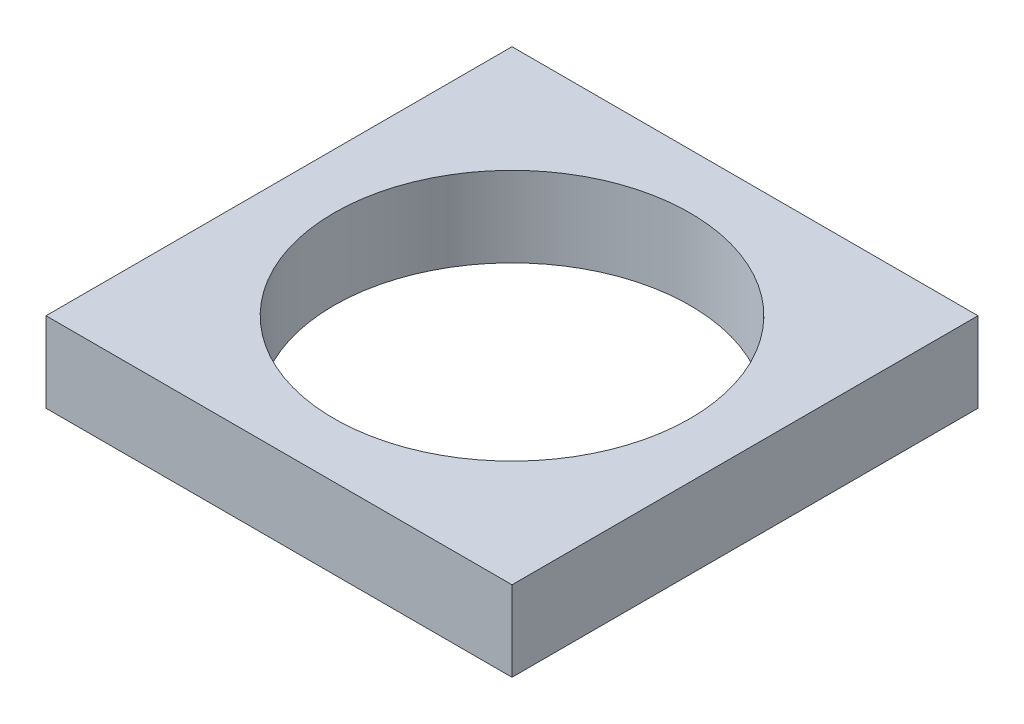
ISO-10303-21;
HEADER;
FILE_DESCRIPTION(('STEP AP214'),'2;1');
FILE_NAME('part.step','',(''),(''),'','','');
FILE_SCHEMA(('AUTOMOTIVE_DESIGN { 1 0 10303 214 1 1 1 1 }'));
ENDSEC;
DATA;
#1=APPLICATION_CONTEXT('core data for automotive mechanical design processes');
#2=APPLICATION_PROTOCOL_DEFINITION('international standard','automotive_design',2000,#1);
#3=PRODUCT_CONTEXT('',#1,'mechanical');
#4=PRODUCT('Part','Part','',(#3));
#5=PRODUCT_RELATED_PRODUCT_CATEGORY('part','',(#4));
#6=PRODUCT_DEFINITION_FORMATION('','',#4);
#7=PRODUCT_DEFINITION_CONTEXT('part definition',#1,'design');
#8=PRODUCT_DEFINITION('design','',#6,#7);
#9=PRODUCT_DEFINITION_SHAPE('','',#8);
#10=(LENGTH_UNIT() NAMED_UNIT(*) SI_UNIT(.MILLI.,.METRE.));
#11=(NAMED_UNIT(*) PLANE_ANGLE_UNIT() SI_UNIT($,.RADIAN.));
#12=(NAMED_UNIT(*) SI_UNIT($,.STERADIAN.) SOLID_ANGLE_UNIT());
#13=UNCERTAINTY_MEASURE_WITH_UNIT(LENGTH_MEASURE(1.E-05),#10,'distance_accuracy_value','');
#14=(GEOMETRIC_REPRESENTATION_CONTEXT(3) GLOBAL_UNCERTAINTY_ASSIGNED_CONTEXT((#13)) GLOBAL_UNIT_ASSIGNED_CONTEXT((#10,
#11,#12)) REPRESENTATION_CONTEXT('',''));
#15=CARTESIAN_POINT('',(0.,0.,0.));
#16=DIRECTION('',(0.,0.,1.));
#17=DIRECTION('',(1.,0.,0.));
#18=AXIS2_PLACEMENT_3D('',#15,#16,#17);
#19=CARTESIAN_POINT('',(0.,-1.35,0.));
#20=DIRECTION('',(0.,1.,0.));
#21=DIRECTION('',(1.,0.,0.));
#22=AXIS2_PLACEMENT_3D('',#19,#20,#21);
#23=PLANE('',#22);
#24=DIRECTION('',(-1.,0.,0.));
#25=VECTOR('',#24,1.);
#26=CARTESIAN_POINT('',(7.85,-1.35,-7.85));
#27=LINE('',#26,#25);
#28=CARTESIAN_POINT('',(7.85,-1.35,-7.85));
#29=VERTEX_POINT('',#28);
#30=CARTESIAN_POINT('',(-7.85,-1.35,-7.85));
#31=VERTEX_POINT('',#30);
#32=EDGE_CURVE('E80',#29,#31,#27,.T.);
#33=ORIENTED_EDGE('',*,*,#32,.F.);
#34=DIRECTION('',(0.,0.,-1.));
#35=VECTOR('',#34,1.);
#36=CARTESIAN_POINT('',(7.85,-1.35,7.85));
#37=LINE('',#36,#35);
#38=CARTESIAN_POINT('',(7.85,-1.35,7.85));
#39=VERTEX_POINT('',#38);
#40=EDGE_CURVE('E36',#39,#29,#37,.T.);
#41=ORIENTED_EDGE('',*,*,#40,.F.);
#42=DIRECTION('',(1.,0.,0.));
#43=VECTOR('',#42,1.);
#44=CARTESIAN_POINT('',(-7.85,-1.35,7.85));
#45=LINE('',#44,#43);
#46=CARTESIAN_POINT('',(-7.85,-1.35,7.85));
#47=VERTEX_POINT('',#46);
#48=EDGE_CURVE('E90',#47,#39,#45,.T.);
#49=ORIENTED_EDGE('',*,*,#48,.F.);
#50=DIRECTION('',(0.,0.,1.));
#51=VECTOR('',#50,1.);
#52=CARTESIAN_POINT('',(-7.85,-1.35,-7.85));
#53=LINE('',#52,#51);
#54=EDGE_CURVE('E82',#31,#47,#53,.T.);
#55=ORIENTED_EDGE('',*,*,#54,.F.);
#56=EDGE_LOOP('',(#33,#41,#49,#55));
#57=FACE_BOUND('',#56,.T.);
#58=CARTESIAN_POINT('',(0.,-1.35,0.));
#59=DIRECTION('',(0.,-1.,0.));
#60=DIRECTION('',(-1.,0.,0.));
#61=AXIS2_PLACEMENT_3D('',#58,#59,#60);
#62=CIRCLE('',#61,6.);
#63=CARTESIAN_POINT('',(-6.,-1.35,0.));
#64=VERTEX_POINT('',#63);
#65=EDGE_CURVE('E11',#64,#64,#62,.T.);
#66=ORIENTED_EDGE('',*,*,#65,.F.);
#67=EDGE_LOOP('',(#66));
#68=FACE_BOUND('',#67,.T.);
#69=ADVANCED_FACE('F17',(#57,#68),#23,.F.);
#70=CARTESIAN_POINT('',(0.,-1.35,0.));
#71=DIRECTION('',(0.,1.,0.));
#72=DIRECTION('',(1.,0.,0.));
#73=AXIS2_PLACEMENT_3D('',#70,#71,#72);
#74=CYLINDRICAL_SURFACE('',#73,6.);
#75=CARTESIAN_POINT('',(0.,1.35,0.));
#76=DIRECTION('',(0.,-1.,0.));
#77=DIRECTION('',(1.,0.,0.));
#78=AXIS2_PLACEMENT_3D('',#75,#76,#77);
#79=CIRCLE('',#78,6.);
#80=CARTESIAN_POINT('',(6.,1.35,0.));
#81=VERTEX_POINT('',#80);
#82=EDGE_CURVE('E73',#81,#81,#79,.T.);
#83=ORIENTED_EDGE('',*,*,#82,.F.);
#84=EDGE_LOOP('',(#83));
#85=FACE_BOUND('',#84,.T.);
#86=ORIENTED_EDGE('',*,*,#65,.T.);
#87=EDGE_LOOP('',(#86));
#88=FACE_BOUND('',#87,.T.);
#89=ADVANCED_FACE('F106',(#85,#88),#74,.F.);
#90=CARTESIAN_POINT('',(0.,1.35,0.));
#91=DIRECTION('',(0.,1.,0.));
#92=DIRECTION('',(1.,0.,0.));
#93=AXIS2_PLACEMENT_3D('',#90,#91,#92);
#94=PLANE('',#93);
#95=DIRECTION('',(1.,0.,0.));
#96=VECTOR('',#95,1.);
#97=CARTESIAN_POINT('',(-7.85,1.35,7.85));
#98=LINE('',#97,#96);
#99=CARTESIAN_POINT('',(-7.85,1.35,7.85));
#100=VERTEX_POINT('',#99);
#101=CARTESIAN_POINT('',(7.85,1.35,7.85));
#102=VERTEX_POINT('',#101);
#103=EDGE_CURVE('E27',#100,#102,#98,.T.);
#104=ORIENTED_EDGE('',*,*,#103,.T.);
#105=DIRECTION('',(0.,0.,-1.));
#106=VECTOR('',#105,1.);
#107=CARTESIAN_POINT('',(7.85,1.35,7.85));
#108=LINE('',#107,#106);
#109=CARTESIAN_POINT('',(7.85,1.35,-7.85));
#110=VERTEX_POINT('',#109);
#111=EDGE_CURVE('E77',#102,#110,#108,.T.);
#112=ORIENTED_EDGE('',*,*,#111,.T.);
#113=DIRECTION('',(-1.,0.,0.));
#114=VECTOR('',#113,1.);
#115=CARTESIAN_POINT('',(7.85,1.35,-7.85));
#116=LINE('',#115,#114);
#117=CARTESIAN_POINT('',(-7.85,1.35,-7.85));
#118=VERTEX_POINT('',#117);
#119=EDGE_CURVE('E58',#110,#118,#116,.T.);
#120=ORIENTED_EDGE('',*,*,#119,.T.);
#121=DIRECTION('',(0.,0.,1.));
#122=VECTOR('',#121,1.);
#123=CARTESIAN_POINT('',(-7.85,1.35,-7.85));
#124=LINE('',#123,#122);
#125=EDGE_CURVE('E64',#118,#100,#124,.T.);
#126=ORIENTED_EDGE('',*,*,#125,.T.);
#127=EDGE_LOOP('',(#104,#112,#120,#126));
#128=FACE_BOUND('',#127,.T.);
#129=ORIENTED_EDGE('',*,*,#82,.T.);
#130=EDGE_LOOP('',(#129));
#131=FACE_BOUND('',#130,.T.);
#132=ADVANCED_FACE('F75',(#128,#131),#94,.T.);
#133=CARTESIAN_POINT('',(-7.85,-1.35,-7.85));
#134=DIRECTION('',(-1.,0.,0.));
#135=DIRECTION('',(0.,0.,1.));
#136=AXIS2_PLACEMENT_3D('',#133,#134,#135);
#137=PLANE('',#136);
#138=DIRECTION('',(0.,1.,0.));
#139=VECTOR('',#138,1.);
#140=CARTESIAN_POINT('',(-7.85,-1.35,7.85));
#141=LINE('',#140,#139);
#142=EDGE_CURVE('E69',#47,#100,#141,.T.);
#143=ORIENTED_EDGE('',*,*,#142,.T.);
#144=ORIENTED_EDGE('',*,*,#125,.F.);
#145=DIRECTION('',(0.,1.,0.));
#146=VECTOR('',#145,1.);
#147=CARTESIAN_POINT('',(-7.85,-1.35,-7.85));
#148=LINE('',#147,#146);
#149=EDGE_CURVE('E67',#31,#118,#148,.T.);
#150=ORIENTED_EDGE('',*,*,#149,.F.);
#151=ORIENTED_EDGE('',*,*,#54,.T.);
#152=EDGE_LOOP('',(#143,#144,#150,#151));
#153=FACE_BOUND('',#152,.T.);
#154=ADVANCED_FACE('F65',(#153),#137,.T.);
#155=CARTESIAN_POINT('',(7.85,-1.35,-7.85));
#156=DIRECTION('',(0.,0.,-1.));
#157=DIRECTION('',(-1.,0.,0.));
#158=AXIS2_PLACEMENT_3D('',#155,#156,#157);
#159=PLANE('',#158);
#160=ORIENTED_EDGE('',*,*,#149,.T.);
#161=ORIENTED_EDGE('',*,*,#119,.F.);
#162=DIRECTION('',(0.,1.,0.));
#163=VECTOR('',#162,1.);
#164=CARTESIAN_POINT('',(7.85,-1.35,-7.85));
#165=LINE('',#164,#163);
#166=EDGE_CURVE('E85',#29,#110,#165,.T.);
#167=ORIENTED_EDGE('',*,*,#166,.F.);
#168=ORIENTED_EDGE('',*,*,#32,.T.);
#169=EDGE_LOOP('',(#160,#161,#167,#168));
#170=FACE_BOUND('',#169,.T.);
#171=ADVANCED_FACE('F79',(#170),#159,.T.);
#172=CARTESIAN_POINT('',(7.85,-1.35,7.85));
#173=DIRECTION('',(1.,0.,0.));
#174=DIRECTION('',(0.,0.,-1.));
#175=AXIS2_PLACEMENT_3D('',#172,#173,#174);
#176=PLANE('',#175);
#177=ORIENTED_EDGE('',*,*,#166,.T.);
#178=ORIENTED_EDGE('',*,*,#111,.F.);
#179=DIRECTION('',(0.,1.,0.));
#180=VECTOR('',#179,1.);
#181=CARTESIAN_POINT('',(7.85,-1.35,7.85));
#182=LINE('',#181,#180);
#183=EDGE_CURVE('E21',#39,#102,#182,.T.);
#184=ORIENTED_EDGE('',*,*,#183,.F.);
#185=ORIENTED_EDGE('',*,*,#40,.T.);
#186=EDGE_LOOP('',(#177,#178,#184,#185));
#187=FACE_BOUND('',#186,.T.);
#188=ADVANCED_FACE('F97',(#187),#176,.T.);
#189=CARTESIAN_POINT('',(-7.85,-1.35,7.85));
#190=DIRECTION('',(0.,0.,1.));
#191=DIRECTION('',(1.,0.,0.));
#192=AXIS2_PLACEMENT_3D('',#189,#190,#191);
#193=PLANE('',#192);
#194=ORIENTED_EDGE('',*,*,#183,.T.);
#195=ORIENTED_EDGE('',*,*,#103,.F.);
#196=ORIENTED_EDGE('',*,*,#142,.F.);
#197=ORIENTED_EDGE('',*,*,#48,.T.);
#198=EDGE_LOOP('',(#194,#195,#196,#197));
#199=FACE_BOUND('',#198,.T.);
#200=ADVANCED_FACE('F19',(#199),#193,.T.);
#201=CLOSED_SHELL('',(#69,#89,#132,#154,#171,#188,#200));
#202=MANIFOLD_SOLID_BREP('B1',#201);
#203=ADVANCED_BREP_SHAPE_REPRESENTATION('',(#18,#202),#14);
#204=SHAPE_DEFINITION_REPRESENTATION(#9,#203);
ENDSEC;
END-ISO-10303-21;
